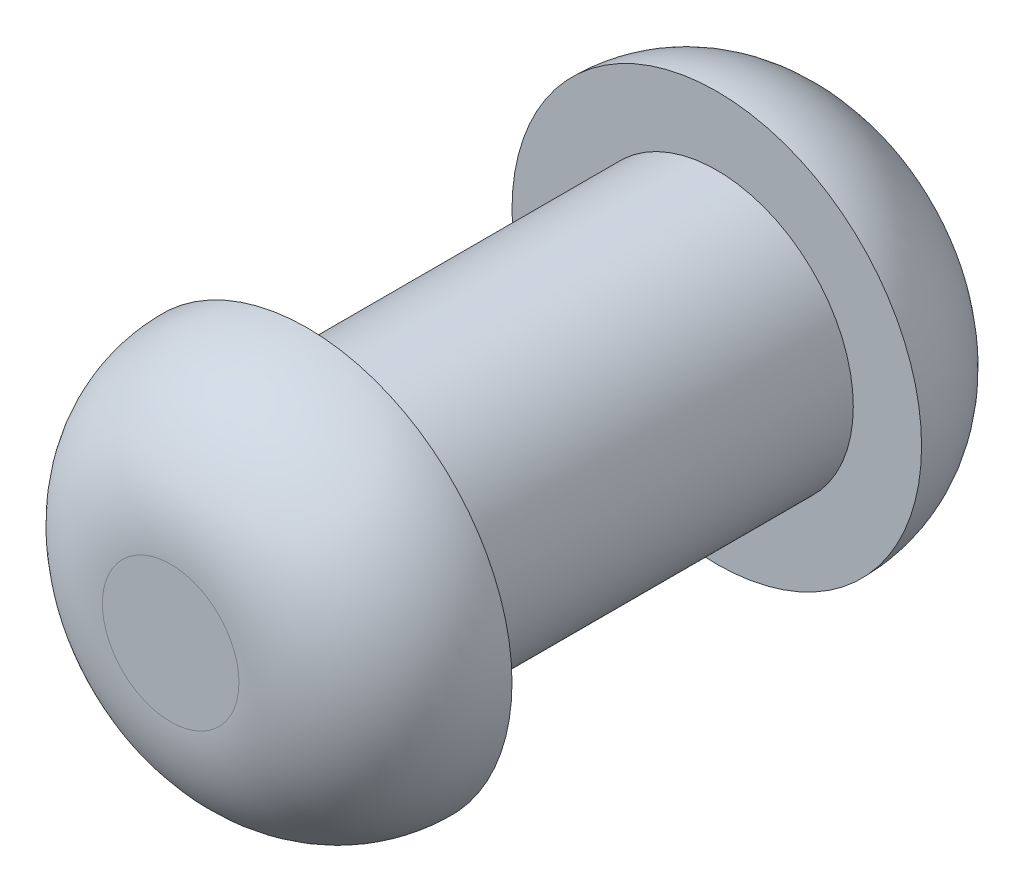
ISO-10303-21;
HEADER;
FILE_DESCRIPTION(('STEP AP214'),'2;1');
FILE_NAME('part.step','',(''),(''),'','','');
FILE_SCHEMA(('AUTOMOTIVE_DESIGN { 1 0 10303 214 1 1 1 1 }'));
ENDSEC;
DATA;
#1=APPLICATION_CONTEXT('core data for automotive mechanical design processes');
#2=APPLICATION_PROTOCOL_DEFINITION('international standard','automotive_design',2000,#1);
#3=PRODUCT_CONTEXT('',#1,'mechanical');
#4=PRODUCT('Part','Part','',(#3));
#5=PRODUCT_RELATED_PRODUCT_CATEGORY('part','',(#4));
#6=PRODUCT_DEFINITION_FORMATION('','',#4);
#7=PRODUCT_DEFINITION_CONTEXT('part definition',#1,'design');
#8=PRODUCT_DEFINITION('design','',#6,#7);
#9=PRODUCT_DEFINITION_SHAPE('','',#8);
#10=(LENGTH_UNIT() NAMED_UNIT(*) SI_UNIT(.MILLI.,.METRE.));
#11=(NAMED_UNIT(*) PLANE_ANGLE_UNIT() SI_UNIT($,.RADIAN.));
#12=(NAMED_UNIT(*) SI_UNIT($,.STERADIAN.) SOLID_ANGLE_UNIT());
#13=UNCERTAINTY_MEASURE_WITH_UNIT(LENGTH_MEASURE(1.E-05),#10,'distance_accuracy_value','');
#14=(GEOMETRIC_REPRESENTATION_CONTEXT(3) GLOBAL_UNCERTAINTY_ASSIGNED_CONTEXT((#13)) GLOBAL_UNIT_ASSIGNED_CONTEXT((#10,
#11,#12)) REPRESENTATION_CONTEXT('',''));
#15=CARTESIAN_POINT('',(0.,0.,0.));
#16=DIRECTION('',(0.,0.,1.));
#17=DIRECTION('',(1.,0.,0.));
#18=AXIS2_PLACEMENT_3D('',#15,#16,#17);
#19=CARTESIAN_POINT('',(0.,0.,15.));
#20=DIRECTION('',(0.,0.,-1.));
#21=DIRECTION('',(-1.,0.,0.));
#22=AXIS2_PLACEMENT_3D('',#19,#20,#21);
#23=CYLINDRICAL_SURFACE('',#22,5.);
#24=CARTESIAN_POINT('',(0.,0.,15.));
#25=DIRECTION('',(0.,0.,1.));
#26=DIRECTION('',(1.,0.,0.));
#27=AXIS2_PLACEMENT_3D('',#24,#25,#26);
#28=CIRCLE('',#27,5.);
#29=CARTESIAN_POINT('',(5.,0.,15.));
#30=VERTEX_POINT('',#29);
#31=EDGE_CURVE('E42',#30,#30,#28,.T.);
#32=ORIENTED_EDGE('',*,*,#31,.F.);
#33=EDGE_LOOP('',(#32));
#34=FACE_BOUND('',#33,.T.);
#35=CARTESIAN_POINT('',(0.,0.,0.));
#36=DIRECTION('',(0.,0.,1.));
#37=DIRECTION('',(1.,0.,0.));
#38=AXIS2_PLACEMENT_3D('',#35,#36,#37);
#39=CIRCLE('',#38,5.);
#40=CARTESIAN_POINT('',(5.,0.,0.));
#41=VERTEX_POINT('',#40);
#42=EDGE_CURVE('E49',#41,#41,#39,.T.);
#43=ORIENTED_EDGE('',*,*,#42,.T.);
#44=EDGE_LOOP('',(#43));
#45=FACE_BOUND('',#44,.T.);
#46=ADVANCED_FACE('F31',(#34,#45),#23,.T.);
#47=CARTESIAN_POINT('',(0.,0.,20.));
#48=DIRECTION('',(0.,0.,1.));
#49=DIRECTION('',(1.,0.,0.));
#50=AXIS2_PLACEMENT_3D('',#47,#48,#49);
#51=PLANE('',#50);
#52=CARTESIAN_POINT('',(0.,0.,20.));
#53=DIRECTION('',(0.,0.,1.));
#54=DIRECTION('',(1.,0.,0.));
#55=AXIS2_PLACEMENT_3D('',#52,#53,#54);
#56=CIRCLE('',#55,2.5);
#57=CARTESIAN_POINT('',(2.5,0.,20.));
#58=VERTEX_POINT('',#57);
#59=EDGE_CURVE('E38',#58,#58,#56,.T.);
#60=ORIENTED_EDGE('',*,*,#59,.T.);
#61=EDGE_LOOP('',(#60));
#62=FACE_BOUND('',#61,.T.);
#63=ADVANCED_FACE('F74',(#62),#51,.T.);
#64=CARTESIAN_POINT('',(0.,0.,15.));
#65=DIRECTION('',(0.,0.,1.));
#66=DIRECTION('',(1.,0.,0.));
#67=AXIS2_PLACEMENT_3D('',#64,#65,#66);
#68=PLANE('',#67);
#69=ORIENTED_EDGE('',*,*,#31,.T.);
#70=EDGE_LOOP('',(#69));
#71=FACE_BOUND('',#70,.T.);
#72=CARTESIAN_POINT('',(0.,0.,15.));
#73=DIRECTION('',(0.,0.,1.));
#74=DIRECTION('',(1.,0.,0.));
#75=AXIS2_PLACEMENT_3D('',#72,#73,#74);
#76=CIRCLE('',#75,7.5);
#77=CARTESIAN_POINT('',(7.5,0.,15.));
#78=VERTEX_POINT('',#77);
#79=EDGE_CURVE('E46',#78,#78,#76,.T.);
#80=ORIENTED_EDGE('',*,*,#79,.F.);
#81=EDGE_LOOP('',(#80));
#82=FACE_BOUND('',#81,.T.);
#83=ADVANCED_FACE('F80',(#71,#82),#68,.F.);
#84=CARTESIAN_POINT('',(0.,0.,15.));
#85=DIRECTION('',(0.,0.,1.));
#86=DIRECTION('',(1.,0.,0.));
#87=AXIS2_PLACEMENT_3D('',#84,#85,#86);
#88=DEGENERATE_TOROIDAL_SURFACE('',#87,2.5,5.,.T.);
#89=ORIENTED_EDGE('',*,*,#79,.T.);
#90=EDGE_LOOP('',(#89));
#91=FACE_BOUND('',#90,.T.);
#92=ORIENTED_EDGE('',*,*,#59,.F.);
#93=EDGE_LOOP('',(#92));
#94=FACE_BOUND('',#93,.T.);
#95=ADVANCED_FACE('F69',(#91,#94),#88,.T.);
#96=CARTESIAN_POINT('',(0.,0.,-5.));
#97=DIRECTION('',(0.,0.,-1.));
#98=DIRECTION('',(-1.,0.,0.));
#99=AXIS2_PLACEMENT_3D('',#96,#97,#98);
#100=PLANE('',#99);
#101=CARTESIAN_POINT('',(0.,0.,-5.));
#102=DIRECTION('',(0.,0.,-1.));
#103=DIRECTION('',(-1.,0.,0.));
#104=AXIS2_PLACEMENT_3D('',#101,#102,#103);
#105=CIRCLE('',#104,2.5);
#106=CARTESIAN_POINT('',(-2.5,0.,-5.));
#107=VERTEX_POINT('',#106);
#108=EDGE_CURVE('E10',#107,#107,#105,.T.);
#109=ORIENTED_EDGE('',*,*,#108,.T.);
#110=EDGE_LOOP('',(#109));
#111=FACE_BOUND('',#110,.T.);
#112=ADVANCED_FACE('F62',(#111),#100,.T.);
#113=CARTESIAN_POINT('',(0.,0.,0.));
#114=DIRECTION('',(0.,0.,-1.));
#115=DIRECTION('',(-1.,0.,0.));
#116=AXIS2_PLACEMENT_3D('',#113,#114,#115);
#117=PLANE('',#116);
#118=ORIENTED_EDGE('',*,*,#42,.F.);
#119=EDGE_LOOP('',(#118));
#120=FACE_BOUND('',#119,.T.);
#121=CARTESIAN_POINT('',(0.,0.,0.));
#122=DIRECTION('',(0.,0.,-1.));
#123=DIRECTION('',(-1.,0.,0.));
#124=AXIS2_PLACEMENT_3D('',#121,#122,#123);
#125=CIRCLE('',#124,7.5);
#126=CARTESIAN_POINT('',(-7.5,0.,0.));
#127=VERTEX_POINT('',#126);
#128=EDGE_CURVE('E51',#127,#127,#125,.T.);
#129=ORIENTED_EDGE('',*,*,#128,.F.);
#130=EDGE_LOOP('',(#129));
#131=FACE_BOUND('',#130,.T.);
#132=ADVANCED_FACE('F60',(#120,#131),#117,.F.);
#133=CARTESIAN_POINT('',(0.,0.,0.));
#134=DIRECTION('',(0.,0.,-1.));
#135=DIRECTION('',(-1.,0.,0.));
#136=AXIS2_PLACEMENT_3D('',#133,#134,#135);
#137=DEGENERATE_TOROIDAL_SURFACE('',#136,2.5,5.,.T.);
#138=ORIENTED_EDGE('',*,*,#128,.T.);
#139=EDGE_LOOP('',(#138));
#140=FACE_BOUND('',#139,.T.);
#141=ORIENTED_EDGE('',*,*,#108,.F.);
#142=EDGE_LOOP('',(#141));
#143=FACE_BOUND('',#142,.T.);
#144=ADVANCED_FACE('F33',(#140,#143),#137,.T.);
#145=CLOSED_SHELL('',(#46,#63,#83,#95,#112,#132,#144));
#146=MANIFOLD_SOLID_BREP('B2',#145);
#147=ADVANCED_BREP_SHAPE_REPRESENTATION('',(#18,#146),#14);
#148=SHAPE_DEFINITION_REPRESENTATION(#9,#147);
ENDSEC;
END-ISO-10303-21;
